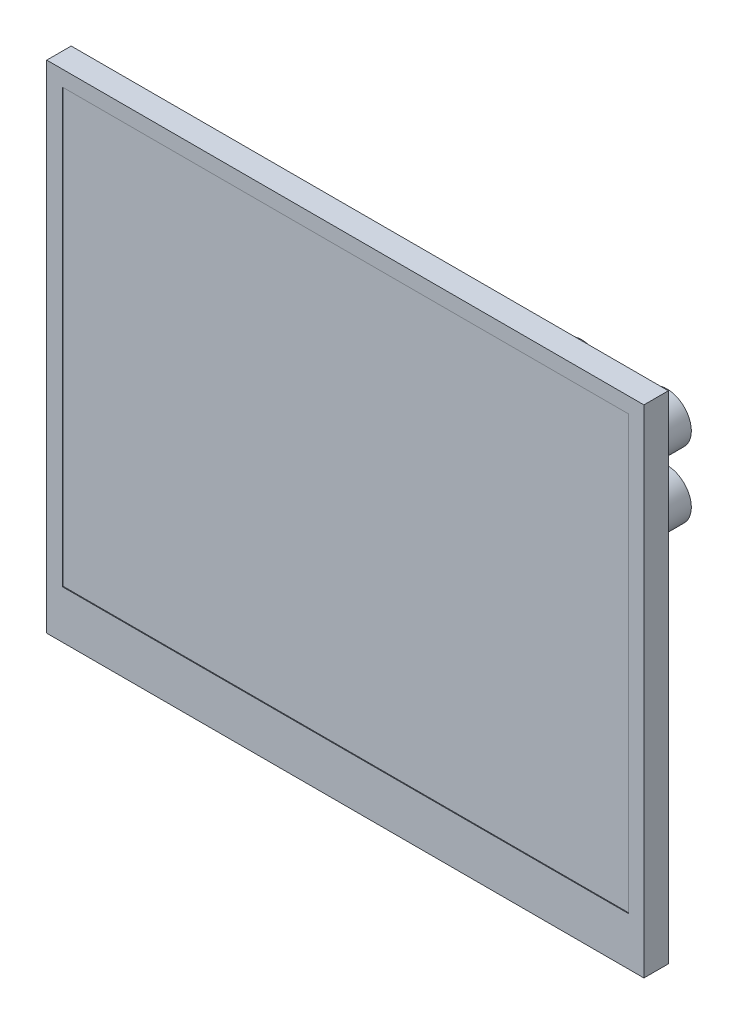
ISO-10303-21;
HEADER;
FILE_DESCRIPTION(('STEP AP214'),'2;1');
FILE_NAME('part.step','',(''),(''),'','','');
FILE_SCHEMA(('AUTOMOTIVE_DESIGN { 1 0 10303 214 1 1 1 1 }'));
ENDSEC;
DATA;
#1=APPLICATION_CONTEXT('core data for automotive mechanical design processes');
#2=APPLICATION_PROTOCOL_DEFINITION('international standard','automotive_design',2000,#1);
#3=PRODUCT_CONTEXT('',#1,'mechanical');
#4=PRODUCT('Part','Part','',(#3));
#5=PRODUCT_RELATED_PRODUCT_CATEGORY('part','',(#4));
#6=PRODUCT_DEFINITION_FORMATION('','',#4);
#7=PRODUCT_DEFINITION_CONTEXT('part definition',#1,'design');
#8=PRODUCT_DEFINITION('design','',#6,#7);
#9=PRODUCT_DEFINITION_SHAPE('','',#8);
#10=(LENGTH_UNIT() NAMED_UNIT(*) SI_UNIT(.MILLI.,.METRE.));
#11=(NAMED_UNIT(*) PLANE_ANGLE_UNIT() SI_UNIT($,.RADIAN.));
#12=(NAMED_UNIT(*) SI_UNIT($,.STERADIAN.) SOLID_ANGLE_UNIT());
#13=UNCERTAINTY_MEASURE_WITH_UNIT(LENGTH_MEASURE(1.E-05),#10,'distance_accuracy_value','');
#14=(GEOMETRIC_REPRESENTATION_CONTEXT(3) GLOBAL_UNCERTAINTY_ASSIGNED_CONTEXT((#13)) GLOBAL_UNIT_ASSIGNED_CONTEXT((#10,
#11,#12)) REPRESENTATION_CONTEXT('',''));
#15=CARTESIAN_POINT('',(0.,0.,0.));
#16=DIRECTION('',(0.,0.,1.));
#17=DIRECTION('',(1.,0.,0.));
#18=AXIS2_PLACEMENT_3D('',#15,#16,#17);
#19=CARTESIAN_POINT('',(0.,0.,-5.575));
#20=DIRECTION('',(0.,0.,-1.));
#21=DIRECTION('',(-1.,0.,0.));
#22=AXIS2_PLACEMENT_3D('',#19,#20,#21);
#23=PLANE('',#22);
#24=CARTESIAN_POINT('',(28.3359525632538,10.470489708499,-5.575));
#25=DIRECTION('',(0.,0.,-1.));
#26=DIRECTION('',(-1.,0.,0.));
#27=AXIS2_PLACEMENT_3D('',#24,#25,#26);
#28=CIRCLE('',#27,3.125);
#29=CARTESIAN_POINT('',(25.2109525632538,10.470489708499,-5.575));
#30=VERTEX_POINT('',#29);
#31=EDGE_CURVE('E212',#30,#30,#28,.T.);
#32=ORIENTED_EDGE('',*,*,#31,.F.);
#33=EDGE_LOOP('',(#32));
#34=FACE_BOUND('',#33,.T.);
#35=CARTESIAN_POINT('',(17.3559379578191,18.999270836998,-5.575));
#36=DIRECTION('',(0.,0.,-1.));
#37=DIRECTION('',(-1.,0.,0.));
#38=AXIS2_PLACEMENT_3D('',#35,#36,#37);
#39=CIRCLE('',#38,3.125);
#40=CARTESIAN_POINT('',(14.2309379578191,18.999270836998,-5.575));
#41=VERTEX_POINT('',#40);
#42=EDGE_CURVE('E216',#41,#41,#39,.T.);
#43=ORIENTED_EDGE('',*,*,#42,.F.);
#44=EDGE_LOOP('',(#43));
#45=FACE_BOUND('',#44,.T.);
#46=CARTESIAN_POINT('',(28.3359525632538,18.999270836998,-5.575));
#47=DIRECTION('',(0.,0.,-1.));
#48=DIRECTION('',(-1.,0.,0.));
#49=AXIS2_PLACEMENT_3D('',#46,#47,#48);
#50=CIRCLE('',#49,3.125);
#51=CARTESIAN_POINT('',(25.2109525632538,18.999270836998,-5.575));
#52=VERTEX_POINT('',#51);
#53=EDGE_CURVE('E222',#52,#52,#50,.T.);
#54=ORIENTED_EDGE('',*,*,#53,.F.);
#55=EDGE_LOOP('',(#54));
#56=FACE_BOUND('',#55,.T.);
#57=DIRECTION('',(0.,-1.,0.));
#58=VECTOR('',#57,1.);
#59=CARTESIAN_POINT('',(34.5,23.25,-5.575));
#60=LINE('',#59,#58);
#61=CARTESIAN_POINT('',(34.5,23.25,-5.575));
#62=VERTEX_POINT('',#61);
#63=CARTESIAN_POINT('',(34.5,-6.75,-5.575));
#64=VERTEX_POINT('',#63);
#65=EDGE_CURVE('E231',#62,#64,#60,.T.);
#66=ORIENTED_EDGE('',*,*,#65,.T.);
#67=DIRECTION('',(-1.,0.,0.));
#68=VECTOR('',#67,1.);
#69=CARTESIAN_POINT('',(34.5,-6.75,-5.575));
#70=LINE('',#69,#68);
#71=CARTESIAN_POINT('',(-21.5,-6.75,-5.575));
#72=VERTEX_POINT('',#71);
#73=EDGE_CURVE('E234',#64,#72,#70,.T.);
#74=ORIENTED_EDGE('',*,*,#73,.T.);
#75=DIRECTION('',(0.,1.,0.));
#76=VECTOR('',#75,1.);
#77=CARTESIAN_POINT('',(-21.5,23.25,-5.575));
#78=LINE('',#77,#76);
#79=CARTESIAN_POINT('',(-21.5,23.25,-5.575));
#80=VERTEX_POINT('',#79);
#81=EDGE_CURVE('E237',#72,#80,#78,.T.);
#82=ORIENTED_EDGE('',*,*,#81,.T.);
#83=DIRECTION('',(1.,0.,0.));
#84=VECTOR('',#83,1.);
#85=CARTESIAN_POINT('',(34.5,23.25,-5.575));
#86=LINE('',#85,#84);
#87=EDGE_CURVE('E239',#80,#62,#86,.T.);
#88=ORIENTED_EDGE('',*,*,#87,.T.);
#89=EDGE_LOOP('',(#66,#74,#82,#88));
#90=FACE_BOUND('',#89,.T.);
#91=DIRECTION('',(-1.,0.,0.));
#92=VECTOR('',#91,1.);
#93=CARTESIAN_POINT('',(6.15030661391654,16.999270836998,-5.575));
#94=LINE('',#93,#92);
#95=CARTESIAN_POINT('',(6.15030661391654,16.999270836998,-5.575));
#96=VERTEX_POINT('',#95);
#97=CARTESIAN_POINT('',(-0.349693386083462,16.9992708369981,-5.575));
#98=VERTEX_POINT('',#97);
#99=EDGE_CURVE('E199',#96,#98,#94,.T.);
#100=ORIENTED_EDGE('',*,*,#99,.F.);
#101=CARTESIAN_POINT('',(6.15030661391654,18.999270836998,-5.575));
#102=DIRECTION('',(0.,0.,-1.));
#103=DIRECTION('',(-1.,0.,0.));
#104=AXIS2_PLACEMENT_3D('',#101,#102,#103);
#105=CIRCLE('',#104,2.);
#106=CARTESIAN_POINT('',(6.15030661391654,20.999270836998,-5.575));
#107=VERTEX_POINT('',#106);
#108=EDGE_CURVE('E182',#107,#96,#105,.T.);
#109=ORIENTED_EDGE('',*,*,#108,.F.);
#110=DIRECTION('',(1.,0.,0.));
#111=VECTOR('',#110,1.);
#112=CARTESIAN_POINT('',(6.15030661391654,20.999270836998,-5.575));
#113=LINE('',#112,#111);
#114=CARTESIAN_POINT('',(-0.349693386083463,20.999270836998,-5.575));
#115=VERTEX_POINT('',#114);
#116=EDGE_CURVE('E190',#115,#107,#113,.T.);
#117=ORIENTED_EDGE('',*,*,#116,.F.);
#118=CARTESIAN_POINT('',(-0.349693386083463,18.999270836998,-5.575));
#119=DIRECTION('',(0.,0.,-1.));
#120=DIRECTION('',(-1.,0.,0.));
#121=AXIS2_PLACEMENT_3D('',#118,#119,#120);
#122=CIRCLE('',#121,2.);
#123=EDGE_CURVE('E201',#98,#115,#122,.T.);
#124=ORIENTED_EDGE('',*,*,#123,.F.);
#125=EDGE_LOOP('',(#100,#109,#117,#124));
#126=FACE_BOUND('',#125,.T.);
#127=ADVANCED_FACE('F33',(#34,#45,#56,#90,#126),#23,.T.);
#128=CARTESIAN_POINT('',(0.,0.,-1.575));
#129=DIRECTION('',(0.,0.,-1.));
#130=DIRECTION('',(-1.,0.,0.));
#131=AXIS2_PLACEMENT_3D('',#128,#129,#130);
#132=PLANE('',#131);
#133=DIRECTION('',(0.,1.,0.));
#134=VECTOR('',#133,1.);
#135=CARTESIAN_POINT('',(38.5,-32.,-1.575));
#136=LINE('',#135,#134);
#137=CARTESIAN_POINT('',(38.5,-32.,-1.575));
#138=VERTEX_POINT('',#137);
#139=CARTESIAN_POINT('',(38.5,32.,-1.575));
#140=VERTEX_POINT('',#139);
#141=EDGE_CURVE('E259',#138,#140,#136,.T.);
#142=ORIENTED_EDGE('',*,*,#141,.F.);
#143=DIRECTION('',(1.,0.,0.));
#144=VECTOR('',#143,1.);
#145=CARTESIAN_POINT('',(-38.5,-32.,-1.575));
#146=LINE('',#145,#144);
#147=CARTESIAN_POINT('',(-38.5,-32.,-1.575));
#148=VERTEX_POINT('',#147);
#149=EDGE_CURVE('E264',#148,#138,#146,.T.);
#150=ORIENTED_EDGE('',*,*,#149,.F.);
#151=DIRECTION('',(0.,-1.,0.));
#152=VECTOR('',#151,1.);
#153=CARTESIAN_POINT('',(-38.5,-32.,-1.575));
#154=LINE('',#153,#152);
#155=CARTESIAN_POINT('',(-38.5,32.,-1.575));
#156=VERTEX_POINT('',#155);
#157=EDGE_CURVE('E275',#156,#148,#154,.T.);
#158=ORIENTED_EDGE('',*,*,#157,.F.);
#159=DIRECTION('',(-1.,0.,0.));
#160=VECTOR('',#159,1.);
#161=CARTESIAN_POINT('',(-38.5,32.,-1.575));
#162=LINE('',#161,#160);
#163=EDGE_CURVE('E273',#140,#156,#162,.T.);
#164=ORIENTED_EDGE('',*,*,#163,.F.);
#165=EDGE_LOOP('',(#142,#150,#158,#164));
#166=FACE_BOUND('',#165,.T.);
#167=DIRECTION('',(-1.,0.,0.));
#168=VECTOR('',#167,1.);
#169=CARTESIAN_POINT('',(34.5,-6.75,-1.575));
#170=LINE('',#169,#168);
#171=CARTESIAN_POINT('',(34.5,-6.75,-1.575));
#172=VERTEX_POINT('',#171);
#173=CARTESIAN_POINT('',(-21.5,-6.75,-1.575));
#174=VERTEX_POINT('',#173);
#175=EDGE_CURVE('E244',#172,#174,#170,.T.);
#176=ORIENTED_EDGE('',*,*,#175,.F.);
#177=DIRECTION('',(0.,-1.,0.));
#178=VECTOR('',#177,1.);
#179=CARTESIAN_POINT('',(34.5,23.25,-1.575));
#180=LINE('',#179,#178);
#181=CARTESIAN_POINT('',(34.5,23.25,-1.575));
#182=VERTEX_POINT('',#181);
#183=EDGE_CURVE('E228',#182,#172,#180,.T.);
#184=ORIENTED_EDGE('',*,*,#183,.F.);
#185=DIRECTION('',(1.,0.,0.));
#186=VECTOR('',#185,1.);
#187=CARTESIAN_POINT('',(34.5,23.25,-1.575));
#188=LINE('',#187,#186);
#189=CARTESIAN_POINT('',(-21.5,23.25,-1.575));
#190=VERTEX_POINT('',#189);
#191=EDGE_CURVE('E235',#190,#182,#188,.T.);
#192=ORIENTED_EDGE('',*,*,#191,.F.);
#193=DIRECTION('',(0.,1.,0.));
#194=VECTOR('',#193,1.);
#195=CARTESIAN_POINT('',(-21.5,23.25,-1.575));
#196=LINE('',#195,#194);
#197=EDGE_CURVE('E246',#174,#190,#196,.T.);
#198=ORIENTED_EDGE('',*,*,#197,.F.);
#199=EDGE_LOOP('',(#176,#184,#192,#198));
#200=FACE_BOUND('',#199,.T.);
#201=ADVANCED_FACE('F293',(#166,#200),#132,.T.);
#202=CARTESIAN_POINT('',(38.5,-32.,1.575));
#203=DIRECTION('',(-1.,0.,0.));
#204=DIRECTION('',(0.,0.,1.));
#205=AXIS2_PLACEMENT_3D('',#202,#203,#204);
#206=PLANE('',#205);
#207=ORIENTED_EDGE('',*,*,#141,.T.);
#208=DIRECTION('',(0.,0.,-1.));
#209=VECTOR('',#208,1.);
#210=CARTESIAN_POINT('',(38.5,32.,1.575));
#211=LINE('',#210,#209);
#212=CARTESIAN_POINT('',(38.5,32.,1.575));
#213=VERTEX_POINT('',#212);
#214=EDGE_CURVE('E11',#213,#140,#211,.T.);
#215=ORIENTED_EDGE('',*,*,#214,.F.);
#216=DIRECTION('',(0.,1.,0.));
#217=VECTOR('',#216,1.);
#218=CARTESIAN_POINT('',(38.5,-32.,1.575));
#219=LINE('',#218,#217);
#220=CARTESIAN_POINT('',(38.5,-32.,1.575));
#221=VERTEX_POINT('',#220);
#222=EDGE_CURVE('E260',#221,#213,#219,.T.);
#223=ORIENTED_EDGE('',*,*,#222,.F.);
#224=DIRECTION('',(0.,0.,-1.));
#225=VECTOR('',#224,1.);
#226=CARTESIAN_POINT('',(38.5,-32.,1.575));
#227=LINE('',#226,#225);
#228=EDGE_CURVE('E270',#221,#138,#227,.T.);
#229=ORIENTED_EDGE('',*,*,#228,.T.);
#230=EDGE_LOOP('',(#207,#215,#223,#229));
#231=FACE_BOUND('',#230,.T.);
#232=ADVANCED_FACE('F35',(#231),#206,.F.);
#233=CARTESIAN_POINT('',(-38.5,32.,1.575));
#234=DIRECTION('',(0.,-1.,0.));
#235=DIRECTION('',(0.,0.,-1.));
#236=AXIS2_PLACEMENT_3D('',#233,#234,#235);
#237=PLANE('',#236);
#238=ORIENTED_EDGE('',*,*,#163,.T.);
#239=DIRECTION('',(0.,0.,-1.));
#240=VECTOR('',#239,1.);
#241=CARTESIAN_POINT('',(-38.5,32.,1.575));
#242=LINE('',#241,#240);
#243=CARTESIAN_POINT('',(-38.5,32.,1.575));
#244=VERTEX_POINT('',#243);
#245=EDGE_CURVE('E41',#244,#156,#242,.T.);
#246=ORIENTED_EDGE('',*,*,#245,.F.);
#247=DIRECTION('',(-1.,0.,0.));
#248=VECTOR('',#247,1.);
#249=CARTESIAN_POINT('',(-38.5,32.,1.575));
#250=LINE('',#249,#248);
#251=EDGE_CURVE('E263',#213,#244,#250,.T.);
#252=ORIENTED_EDGE('',*,*,#251,.F.);
#253=ORIENTED_EDGE('',*,*,#214,.T.);
#254=EDGE_LOOP('',(#238,#246,#252,#253));
#255=FACE_BOUND('',#254,.T.);
#256=ADVANCED_FACE('F304',(#255),#237,.F.);
#257=CARTESIAN_POINT('',(-38.5,-32.,1.575));
#258=DIRECTION('',(1.,0.,0.));
#259=DIRECTION('',(0.,0.,-1.));
#260=AXIS2_PLACEMENT_3D('',#257,#258,#259);
#261=PLANE('',#260);
#262=ORIENTED_EDGE('',*,*,#157,.T.);
#263=DIRECTION('',(0.,0.,-1.));
#264=VECTOR('',#263,1.);
#265=CARTESIAN_POINT('',(-38.5,-32.,1.575));
#266=LINE('',#265,#264);
#267=CARTESIAN_POINT('',(-38.5,-32.,1.575));
#268=VERTEX_POINT('',#267);
#269=EDGE_CURVE('E280',#268,#148,#266,.T.);
#270=ORIENTED_EDGE('',*,*,#269,.F.);
#271=DIRECTION('',(0.,-1.,0.));
#272=VECTOR('',#271,1.);
#273=CARTESIAN_POINT('',(-38.5,-32.,1.575));
#274=LINE('',#273,#272);
#275=EDGE_CURVE('E266',#244,#268,#274,.T.);
#276=ORIENTED_EDGE('',*,*,#275,.F.);
#277=ORIENTED_EDGE('',*,*,#245,.T.);
#278=EDGE_LOOP('',(#262,#270,#276,#277));
#279=FACE_BOUND('',#278,.T.);
#280=ADVANCED_FACE('F287',(#279),#261,.F.);
#281=CARTESIAN_POINT('',(-38.5,-32.,1.575));
#282=DIRECTION('',(0.,1.,0.));
#283=DIRECTION('',(0.,0.,1.));
#284=AXIS2_PLACEMENT_3D('',#281,#282,#283);
#285=PLANE('',#284);
#286=ORIENTED_EDGE('',*,*,#149,.T.);
#287=ORIENTED_EDGE('',*,*,#228,.F.);
#288=DIRECTION('',(1.,0.,0.));
#289=VECTOR('',#288,1.);
#290=CARTESIAN_POINT('',(-38.5,-32.,1.575));
#291=LINE('',#290,#289);
#292=EDGE_CURVE('E268',#268,#221,#291,.T.);
#293=ORIENTED_EDGE('',*,*,#292,.F.);
#294=ORIENTED_EDGE('',*,*,#269,.T.);
#295=EDGE_LOOP('',(#286,#287,#293,#294));
#296=FACE_BOUND('',#295,.T.);
#297=ADVANCED_FACE('F297',(#296),#285,.F.);
#298=CARTESIAN_POINT('',(0.,0.,1.575));
#299=DIRECTION('',(0.,0.,-1.));
#300=DIRECTION('',(-1.,0.,0.));
#301=AXIS2_PLACEMENT_3D('',#298,#299,#300);
#302=PLANE('',#301);
#303=DIRECTION('',(1.,0.,0.));
#304=VECTOR('',#303,1.);
#305=CARTESIAN_POINT('',(-36.5,-25.8,1.575));
#306=LINE('',#305,#304);
#307=CARTESIAN_POINT('',(-36.5,-25.8,1.575));
#308=VERTEX_POINT('',#307);
#309=CARTESIAN_POINT('',(36.5,-25.8,1.575));
#310=VERTEX_POINT('',#309);
#311=EDGE_CURVE('E176',#308,#310,#306,.T.);
#312=ORIENTED_EDGE('',*,*,#311,.F.);
#313=DIRECTION('',(0.,-1.,0.));
#314=VECTOR('',#313,1.);
#315=CARTESIAN_POINT('',(-36.5,30.,1.575));
#316=LINE('',#315,#314);
#317=CARTESIAN_POINT('',(-36.5,30.,1.575));
#318=VERTEX_POINT('',#317);
#319=EDGE_CURVE('E48',#318,#308,#316,.T.);
#320=ORIENTED_EDGE('',*,*,#319,.F.);
#321=DIRECTION('',(-1.,0.,0.));
#322=VECTOR('',#321,1.);
#323=CARTESIAN_POINT('',(-36.5,30.,1.575));
#324=LINE('',#323,#322);
#325=CARTESIAN_POINT('',(36.5,30.,1.575));
#326=VERTEX_POINT('',#325);
#327=EDGE_CURVE('E167',#326,#318,#324,.T.);
#328=ORIENTED_EDGE('',*,*,#327,.F.);
#329=DIRECTION('',(0.,1.,0.));
#330=VECTOR('',#329,1.);
#331=CARTESIAN_POINT('',(36.5,30.,1.575));
#332=LINE('',#331,#330);
#333=EDGE_CURVE('E170',#310,#326,#332,.T.);
#334=ORIENTED_EDGE('',*,*,#333,.F.);
#335=EDGE_LOOP('',(#312,#320,#328,#334));
#336=FACE_BOUND('',#335,.T.);
#337=ORIENTED_EDGE('',*,*,#222,.T.);
#338=ORIENTED_EDGE('',*,*,#251,.T.);
#339=ORIENTED_EDGE('',*,*,#275,.T.);
#340=ORIENTED_EDGE('',*,*,#292,.T.);
#341=EDGE_LOOP('',(#337,#338,#339,#340));
#342=FACE_BOUND('',#341,.T.);
#343=ADVANCED_FACE('F303',(#336,#342),#302,.F.);
#344=CARTESIAN_POINT('',(34.5,23.25,-5.575));
#345=DIRECTION('',(-1.,0.,0.));
#346=DIRECTION('',(0.,-1.,0.));
#347=AXIS2_PLACEMENT_3D('',#344,#345,#346);
#348=PLANE('',#347);
#349=ORIENTED_EDGE('',*,*,#183,.T.);
#350=DIRECTION('',(0.,0.,1.));
#351=VECTOR('',#350,1.);
#352=CARTESIAN_POINT('',(34.5,-6.75,-5.575));
#353=LINE('',#352,#351);
#354=EDGE_CURVE('E257',#64,#172,#353,.T.);
#355=ORIENTED_EDGE('',*,*,#354,.F.);
#356=ORIENTED_EDGE('',*,*,#65,.F.);
#357=DIRECTION('',(0.,0.,1.));
#358=VECTOR('',#357,1.);
#359=CARTESIAN_POINT('',(34.5,23.25,-5.575));
#360=LINE('',#359,#358);
#361=EDGE_CURVE('E241',#62,#182,#360,.T.);
#362=ORIENTED_EDGE('',*,*,#361,.T.);
#363=EDGE_LOOP('',(#349,#355,#356,#362));
#364=FACE_BOUND('',#363,.T.);
#365=ADVANCED_FACE('F335',(#364),#348,.F.);
#366=CARTESIAN_POINT('',(34.5,-6.75,-5.575));
#367=DIRECTION('',(0.,1.,0.));
#368=DIRECTION('',(0.,0.,1.));
#369=AXIS2_PLACEMENT_3D('',#366,#367,#368);
#370=PLANE('',#369);
#371=ORIENTED_EDGE('',*,*,#175,.T.);
#372=DIRECTION('',(0.,0.,1.));
#373=VECTOR('',#372,1.);
#374=CARTESIAN_POINT('',(-21.5,-6.75,-5.575));
#375=LINE('',#374,#373);
#376=EDGE_CURVE('E254',#72,#174,#375,.T.);
#377=ORIENTED_EDGE('',*,*,#376,.F.);
#378=ORIENTED_EDGE('',*,*,#73,.F.);
#379=ORIENTED_EDGE('',*,*,#354,.T.);
#380=EDGE_LOOP('',(#371,#377,#378,#379));
#381=FACE_BOUND('',#380,.T.);
#382=ADVANCED_FACE('F331',(#381),#370,.F.);
#383=CARTESIAN_POINT('',(-21.5,23.25,-5.575));
#384=DIRECTION('',(1.,0.,0.));
#385=DIRECTION('',(0.,1.,0.));
#386=AXIS2_PLACEMENT_3D('',#383,#384,#385);
#387=PLANE('',#386);
#388=ORIENTED_EDGE('',*,*,#197,.T.);
#389=DIRECTION('',(0.,0.,1.));
#390=VECTOR('',#389,1.);
#391=CARTESIAN_POINT('',(-21.5,23.25,-5.575));
#392=LINE('',#391,#390);
#393=EDGE_CURVE('E252',#80,#190,#392,.T.);
#394=ORIENTED_EDGE('',*,*,#393,.F.);
#395=ORIENTED_EDGE('',*,*,#81,.F.);
#396=ORIENTED_EDGE('',*,*,#376,.T.);
#397=EDGE_LOOP('',(#388,#394,#395,#396));
#398=FACE_BOUND('',#397,.T.);
#399=ADVANCED_FACE('F327',(#398),#387,.F.);
#400=CARTESIAN_POINT('',(34.5,23.25,-5.575));
#401=DIRECTION('',(0.,-1.,0.));
#402=DIRECTION('',(0.,0.,-1.));
#403=AXIS2_PLACEMENT_3D('',#400,#401,#402);
#404=PLANE('',#403);
#405=ORIENTED_EDGE('',*,*,#191,.T.);
#406=ORIENTED_EDGE('',*,*,#361,.F.);
#407=ORIENTED_EDGE('',*,*,#87,.F.);
#408=ORIENTED_EDGE('',*,*,#393,.T.);
#409=EDGE_LOOP('',(#405,#406,#407,#408));
#410=FACE_BOUND('',#409,.T.);
#411=ADVANCED_FACE('F324',(#410),#404,.F.);
#412=CARTESIAN_POINT('',(28.3359525632538,18.999270836998,-11.575));
#413=DIRECTION('',(0.,0.,1.));
#414=DIRECTION('',(1.,0.,0.));
#415=AXIS2_PLACEMENT_3D('',#412,#413,#414);
#416=CYLINDRICAL_SURFACE('',#415,3.125);
#417=CARTESIAN_POINT('',(28.3359525632538,18.999270836998,-11.575));
#418=DIRECTION('',(0.,0.,-1.));
#419=DIRECTION('',(-1.,0.,0.));
#420=AXIS2_PLACEMENT_3D('',#417,#418,#419);
#421=CIRCLE('',#420,3.125);
#422=CARTESIAN_POINT('',(25.2109525632538,18.999270836998,-11.575));
#423=VERTEX_POINT('',#422);
#424=EDGE_CURVE('E225',#423,#423,#421,.T.);
#425=ORIENTED_EDGE('',*,*,#424,.F.);
#426=EDGE_LOOP('',(#425));
#427=FACE_BOUND('',#426,.T.);
#428=ORIENTED_EDGE('',*,*,#53,.T.);
#429=EDGE_LOOP('',(#428));
#430=FACE_BOUND('',#429,.T.);
#431=ADVANCED_FACE('F322',(#427,#430),#416,.T.);
#432=CARTESIAN_POINT('',(28.3359525632538,18.999270836998,-11.575));
#433=DIRECTION('',(0.,0.,-1.));
#434=DIRECTION('',(-1.,0.,0.));
#435=AXIS2_PLACEMENT_3D('',#432,#433,#434);
#436=PLANE('',#435);
#437=ORIENTED_EDGE('',*,*,#424,.T.);
#438=EDGE_LOOP('',(#437));
#439=FACE_BOUND('',#438,.T.);
#440=ADVANCED_FACE('F377',(#439),#436,.T.);
#441=CARTESIAN_POINT('',(17.3559379578191,18.999270836998,-11.575));
#442=DIRECTION('',(0.,0.,1.));
#443=DIRECTION('',(1.,0.,0.));
#444=AXIS2_PLACEMENT_3D('',#441,#442,#443);
#445=CYLINDRICAL_SURFACE('',#444,3.125);
#446=CARTESIAN_POINT('',(17.3559379578191,18.999270836998,-11.575));
#447=DIRECTION('',(0.,0.,-1.));
#448=DIRECTION('',(-1.,0.,0.));
#449=AXIS2_PLACEMENT_3D('',#446,#447,#448);
#450=CIRCLE('',#449,3.125);
#451=CARTESIAN_POINT('',(14.2309379578191,18.999270836998,-11.575));
#452=VERTEX_POINT('',#451);
#453=EDGE_CURVE('E219',#452,#452,#450,.T.);
#454=ORIENTED_EDGE('',*,*,#453,.F.);
#455=EDGE_LOOP('',(#454));
#456=FACE_BOUND('',#455,.T.);
#457=ORIENTED_EDGE('',*,*,#42,.T.);
#458=EDGE_LOOP('',(#457));
#459=FACE_BOUND('',#458,.T.);
#460=ADVANCED_FACE('F384',(#456,#459),#445,.T.);
#461=CARTESIAN_POINT('',(17.3559379578191,18.999270836998,-11.575));
#462=DIRECTION('',(0.,0.,-1.));
#463=DIRECTION('',(-1.,0.,0.));
#464=AXIS2_PLACEMENT_3D('',#461,#462,#463);
#465=PLANE('',#464);
#466=ORIENTED_EDGE('',*,*,#453,.T.);
#467=EDGE_LOOP('',(#466));
#468=FACE_BOUND('',#467,.T.);
#469=ADVANCED_FACE('F391',(#468),#465,.T.);
#470=CARTESIAN_POINT('',(28.3359525632538,10.470489708499,-11.575));
#471=DIRECTION('',(0.,0.,1.));
#472=DIRECTION('',(1.,0.,0.));
#473=AXIS2_PLACEMENT_3D('',#470,#471,#472);
#474=CYLINDRICAL_SURFACE('',#473,3.125);
#475=CARTESIAN_POINT('',(28.3359525632538,10.470489708499,-11.575));
#476=DIRECTION('',(0.,0.,-1.));
#477=DIRECTION('',(-1.,0.,0.));
#478=AXIS2_PLACEMENT_3D('',#475,#476,#477);
#479=CIRCLE('',#478,3.125);
#480=CARTESIAN_POINT('',(25.2109525632538,10.470489708499,-11.575));
#481=VERTEX_POINT('',#480);
#482=EDGE_CURVE('E213',#481,#481,#479,.T.);
#483=ORIENTED_EDGE('',*,*,#482,.F.);
#484=EDGE_LOOP('',(#483));
#485=FACE_BOUND('',#484,.T.);
#486=ORIENTED_EDGE('',*,*,#31,.T.);
#487=EDGE_LOOP('',(#486));
#488=FACE_BOUND('',#487,.T.);
#489=ADVANCED_FACE('F399',(#485,#488),#474,.T.);
#490=CARTESIAN_POINT('',(28.3359525632538,10.470489708499,-11.575));
#491=DIRECTION('',(0.,0.,-1.));
#492=DIRECTION('',(-1.,0.,0.));
#493=AXIS2_PLACEMENT_3D('',#490,#491,#492);
#494=PLANE('',#493);
#495=ORIENTED_EDGE('',*,*,#482,.T.);
#496=EDGE_LOOP('',(#495));
#497=FACE_BOUND('',#496,.T.);
#498=ADVANCED_FACE('F407',(#497),#494,.T.);
#499=CARTESIAN_POINT('',(6.15030661391654,18.999270836998,-11.575));
#500=DIRECTION('',(0.,0.,1.));
#501=DIRECTION('',(1.,0.,0.));
#502=AXIS2_PLACEMENT_3D('',#499,#500,#501);
#503=CYLINDRICAL_SURFACE('',#502,2.);
#504=ORIENTED_EDGE('',*,*,#108,.T.);
#505=DIRECTION('',(0.,0.,1.));
#506=VECTOR('',#505,1.);
#507=CARTESIAN_POINT('',(6.15030661391654,16.999270836998,-11.575));
#508=LINE('',#507,#506);
#509=CARTESIAN_POINT('',(6.15030661391654,16.999270836998,-11.575));
#510=VERTEX_POINT('',#509);
#511=EDGE_CURVE('E210',#510,#96,#508,.T.);
#512=ORIENTED_EDGE('',*,*,#511,.F.);
#513=CARTESIAN_POINT('',(6.15030661391654,18.999270836998,-11.575));
#514=DIRECTION('',(0.,0.,-1.));
#515=DIRECTION('',(-1.,0.,0.));
#516=AXIS2_PLACEMENT_3D('',#513,#514,#515);
#517=CIRCLE('',#516,2.);
#518=CARTESIAN_POINT('',(6.15030661391654,20.999270836998,-11.575));
#519=VERTEX_POINT('',#518);
#520=EDGE_CURVE('E186',#519,#510,#517,.T.);
#521=ORIENTED_EDGE('',*,*,#520,.F.);
#522=DIRECTION('',(0.,0.,1.));
#523=VECTOR('',#522,1.);
#524=CARTESIAN_POINT('',(6.15030661391654,20.999270836998,-11.575));
#525=LINE('',#524,#523);
#526=EDGE_CURVE('E196',#519,#107,#525,.T.);
#527=ORIENTED_EDGE('',*,*,#526,.T.);
#528=EDGE_LOOP('',(#504,#512,#521,#527));
#529=FACE_BOUND('',#528,.T.);
#530=ADVANCED_FACE('F415',(#529),#503,.T.);
#531=CARTESIAN_POINT('',(6.15030661391654,16.999270836998,-11.575));
#532=DIRECTION('',(0.,1.,0.));
#533=DIRECTION('',(-1.,0.,0.));
#534=AXIS2_PLACEMENT_3D('',#531,#532,#533);
#535=PLANE('',#534);
#536=ORIENTED_EDGE('',*,*,#99,.T.);
#537=DIRECTION('',(0.,0.,1.));
#538=VECTOR('',#537,1.);
#539=CARTESIAN_POINT('',(-0.349693386083462,16.9992708369981,-11.575));
#540=LINE('',#539,#538);
#541=CARTESIAN_POINT('',(-0.349693386083462,16.9992708369981,-11.575));
#542=VERTEX_POINT('',#541);
#543=EDGE_CURVE('E207',#542,#98,#540,.T.);
#544=ORIENTED_EDGE('',*,*,#543,.F.);
#545=DIRECTION('',(-1.,0.,0.));
#546=VECTOR('',#545,1.);
#547=CARTESIAN_POINT('',(6.15030661391654,16.999270836998,-11.575));
#548=LINE('',#547,#546);
#549=EDGE_CURVE('E189',#510,#542,#548,.T.);
#550=ORIENTED_EDGE('',*,*,#549,.F.);
#551=ORIENTED_EDGE('',*,*,#511,.T.);
#552=EDGE_LOOP('',(#536,#544,#550,#551));
#553=FACE_BOUND('',#552,.T.);
#554=ADVANCED_FACE('F423',(#553),#535,.F.);
#555=CARTESIAN_POINT('',(-0.349693386083463,18.999270836998,-11.575));
#556=DIRECTION('',(0.,0.,1.));
#557=DIRECTION('',(1.,0.,0.));
#558=AXIS2_PLACEMENT_3D('',#555,#556,#557);
#559=CYLINDRICAL_SURFACE('',#558,2.);
#560=ORIENTED_EDGE('',*,*,#123,.T.);
#561=DIRECTION('',(0.,0.,1.));
#562=VECTOR('',#561,1.);
#563=CARTESIAN_POINT('',(-0.349693386083463,20.999270836998,-11.575));
#564=LINE('',#563,#562);
#565=CARTESIAN_POINT('',(-0.349693386083463,20.999270836998,-11.575));
#566=VERTEX_POINT('',#565);
#567=EDGE_CURVE('E56',#566,#115,#564,.T.);
#568=ORIENTED_EDGE('',*,*,#567,.F.);
#569=CARTESIAN_POINT('',(-0.349693386083463,18.999270836998,-11.575));
#570=DIRECTION('',(0.,0.,-1.));
#571=DIRECTION('',(-1.,0.,0.));
#572=AXIS2_PLACEMENT_3D('',#569,#570,#571);
#573=CIRCLE('',#572,2.);
#574=EDGE_CURVE('E192',#542,#566,#573,.T.);
#575=ORIENTED_EDGE('',*,*,#574,.F.);
#576=ORIENTED_EDGE('',*,*,#543,.T.);
#577=EDGE_LOOP('',(#560,#568,#575,#576));
#578=FACE_BOUND('',#577,.T.);
#579=ADVANCED_FACE('F431',(#578),#559,.T.);
#580=CARTESIAN_POINT('',(6.15030661391654,20.999270836998,-11.575));
#581=DIRECTION('',(0.,-1.,0.));
#582=DIRECTION('',(0.,0.,-1.));
#583=AXIS2_PLACEMENT_3D('',#580,#581,#582);
#584=PLANE('',#583);
#585=ORIENTED_EDGE('',*,*,#116,.T.);
#586=ORIENTED_EDGE('',*,*,#526,.F.);
#587=DIRECTION('',(1.,0.,0.));
#588=VECTOR('',#587,1.);
#589=CARTESIAN_POINT('',(6.15030661391654,20.999270836998,-11.575));
#590=LINE('',#589,#588);
#591=EDGE_CURVE('E194',#566,#519,#590,.T.);
#592=ORIENTED_EDGE('',*,*,#591,.F.);
#593=ORIENTED_EDGE('',*,*,#567,.T.);
#594=EDGE_LOOP('',(#585,#586,#592,#593));
#595=FACE_BOUND('',#594,.T.);
#596=ADVANCED_FACE('F439',(#595),#584,.F.);
#597=CARTESIAN_POINT('',(6.15030661391654,18.999270836998,-11.575));
#598=DIRECTION('',(0.,0.,-1.));
#599=DIRECTION('',(-1.,0.,0.));
#600=AXIS2_PLACEMENT_3D('',#597,#598,#599);
#601=PLANE('',#600);
#602=ORIENTED_EDGE('',*,*,#520,.T.);
#603=ORIENTED_EDGE('',*,*,#549,.T.);
#604=ORIENTED_EDGE('',*,*,#574,.T.);
#605=ORIENTED_EDGE('',*,*,#591,.T.);
#606=EDGE_LOOP('',(#602,#603,#604,#605));
#607=FACE_BOUND('',#606,.T.);
#608=ADVANCED_FACE('F447',(#607),#601,.T.);
#609=CARTESIAN_POINT('',(-36.5,30.,1.475));
#610=DIRECTION('',(-1.,0.,0.));
#611=DIRECTION('',(0.,-1.,0.));
#612=AXIS2_PLACEMENT_3D('',#609,#610,#611);
#613=PLANE('',#612);
#614=ORIENTED_EDGE('',*,*,#319,.T.);
#615=DIRECTION('',(0.,0.,1.));
#616=VECTOR('',#615,1.);
#617=CARTESIAN_POINT('',(-36.5,-25.8,1.475));
#618=LINE('',#617,#616);
#619=CARTESIAN_POINT('',(-36.5,-25.8,1.475));
#620=VERTEX_POINT('',#619);
#621=EDGE_CURVE('E145',#620,#308,#618,.T.);
#622=ORIENTED_EDGE('',*,*,#621,.F.);
#623=DIRECTION('',(0.,-1.,0.));
#624=VECTOR('',#623,1.);
#625=CARTESIAN_POINT('',(-36.5,30.,1.475));
#626=LINE('',#625,#624);
#627=CARTESIAN_POINT('',(-36.5,30.,1.475));
#628=VERTEX_POINT('',#627);
#629=EDGE_CURVE('E149',#628,#620,#626,.T.);
#630=ORIENTED_EDGE('',*,*,#629,.F.);
#631=DIRECTION('',(0.,0.,1.));
#632=VECTOR('',#631,1.);
#633=CARTESIAN_POINT('',(-36.5,30.,1.475));
#634=LINE('',#633,#632);
#635=EDGE_CURVE('E180',#628,#318,#634,.T.);
#636=ORIENTED_EDGE('',*,*,#635,.T.);
#637=EDGE_LOOP('',(#614,#622,#630,#636));
#638=FACE_BOUND('',#637,.T.);
#639=ADVANCED_FACE('F147',(#638),#613,.F.);
#640=CARTESIAN_POINT('',(-36.5,30.,1.475));
#641=DIRECTION('',(0.,1.,0.));
#642=DIRECTION('',(0.,0.,1.));
#643=AXIS2_PLACEMENT_3D('',#640,#641,#642);
#644=PLANE('',#643);
#645=ORIENTED_EDGE('',*,*,#327,.T.);
#646=ORIENTED_EDGE('',*,*,#635,.F.);
#647=DIRECTION('',(-1.,0.,0.));
#648=VECTOR('',#647,1.);
#649=CARTESIAN_POINT('',(-36.5,30.,1.475));
#650=LINE('',#649,#648);
#651=CARTESIAN_POINT('',(36.5,30.,1.475));
#652=VERTEX_POINT('',#651);
#653=EDGE_CURVE('E155',#652,#628,#650,.T.);
#654=ORIENTED_EDGE('',*,*,#653,.F.);
#655=DIRECTION('',(0.,0.,1.));
#656=VECTOR('',#655,1.);
#657=CARTESIAN_POINT('',(36.5,30.,1.475));
#658=LINE('',#657,#656);
#659=EDGE_CURVE('E183',#652,#326,#658,.T.);
#660=ORIENTED_EDGE('',*,*,#659,.T.);
#661=EDGE_LOOP('',(#645,#646,#654,#660));
#662=FACE_BOUND('',#661,.T.);
#663=ADVANCED_FACE('F459',(#662),#644,.F.);
#664=CARTESIAN_POINT('',(36.5,30.,1.475));
#665=DIRECTION('',(1.,0.,0.));
#666=DIRECTION('',(0.,1.,0.));
#667=AXIS2_PLACEMENT_3D('',#664,#665,#666);
#668=PLANE('',#667);
#669=ORIENTED_EDGE('',*,*,#333,.T.);
#670=ORIENTED_EDGE('',*,*,#659,.F.);
#671=DIRECTION('',(0.,1.,0.));
#672=VECTOR('',#671,1.);
#673=CARTESIAN_POINT('',(36.5,30.,1.475));
#674=LINE('',#673,#672);
#675=CARTESIAN_POINT('',(36.5,-25.8,1.475));
#676=VERTEX_POINT('',#675);
#677=EDGE_CURVE('E163',#676,#652,#674,.T.);
#678=ORIENTED_EDGE('',*,*,#677,.F.);
#679=DIRECTION('',(0.,0.,1.));
#680=VECTOR('',#679,1.);
#681=CARTESIAN_POINT('',(36.5,-25.8,1.475));
#682=LINE('',#681,#680);
#683=EDGE_CURVE('E154',#676,#310,#682,.T.);
#684=ORIENTED_EDGE('',*,*,#683,.T.);
#685=EDGE_LOOP('',(#669,#670,#678,#684));
#686=FACE_BOUND('',#685,.T.);
#687=ADVANCED_FACE('F466',(#686),#668,.F.);
#688=CARTESIAN_POINT('',(-36.5,-25.8,1.475));
#689=DIRECTION('',(0.,-1.,0.));
#690=DIRECTION('',(0.,0.,-1.));
#691=AXIS2_PLACEMENT_3D('',#688,#689,#690);
#692=PLANE('',#691);
#693=ORIENTED_EDGE('',*,*,#311,.T.);
#694=ORIENTED_EDGE('',*,*,#683,.F.);
#695=DIRECTION('',(1.,0.,0.));
#696=VECTOR('',#695,1.);
#697=CARTESIAN_POINT('',(-36.5,-25.8,1.475));
#698=LINE('',#697,#696);
#699=EDGE_CURVE('E158',#620,#676,#698,.T.);
#700=ORIENTED_EDGE('',*,*,#699,.F.);
#701=ORIENTED_EDGE('',*,*,#621,.T.);
#702=EDGE_LOOP('',(#693,#694,#700,#701));
#703=FACE_BOUND('',#702,.T.);
#704=ADVANCED_FACE('F159',(#703),#692,.F.);
#705=CARTESIAN_POINT('',(0.,0.,1.475));
#706=DIRECTION('',(0.,0.,1.));
#707=DIRECTION('',(1.,0.,0.));
#708=AXIS2_PLACEMENT_3D('',#705,#706,#707);
#709=PLANE('',#708);
#710=ORIENTED_EDGE('',*,*,#629,.T.);
#711=ORIENTED_EDGE('',*,*,#699,.T.);
#712=ORIENTED_EDGE('',*,*,#677,.T.);
#713=ORIENTED_EDGE('',*,*,#653,.T.);
#714=EDGE_LOOP('',(#710,#711,#712,#713));
#715=FACE_BOUND('',#714,.T.);
#716=ADVANCED_FACE('F165',(#715),#709,.T.);
#717=CLOSED_SHELL('',(#127,#201,#232,#256,#280,#297,#343,#365,#382,#399,#411,#431,#440,#460,
#469,#489,#498,#530,#554,#579,#596,#608,#639,#663,#687,#704,#716));
#718=MANIFOLD_SOLID_BREP('B2',#717);
#719=ADVANCED_BREP_SHAPE_REPRESENTATION('',(#18,#718),#14);
#720=SHAPE_DEFINITION_REPRESENTATION(#9,#719);
ENDSEC;
END-ISO-10303-21;
